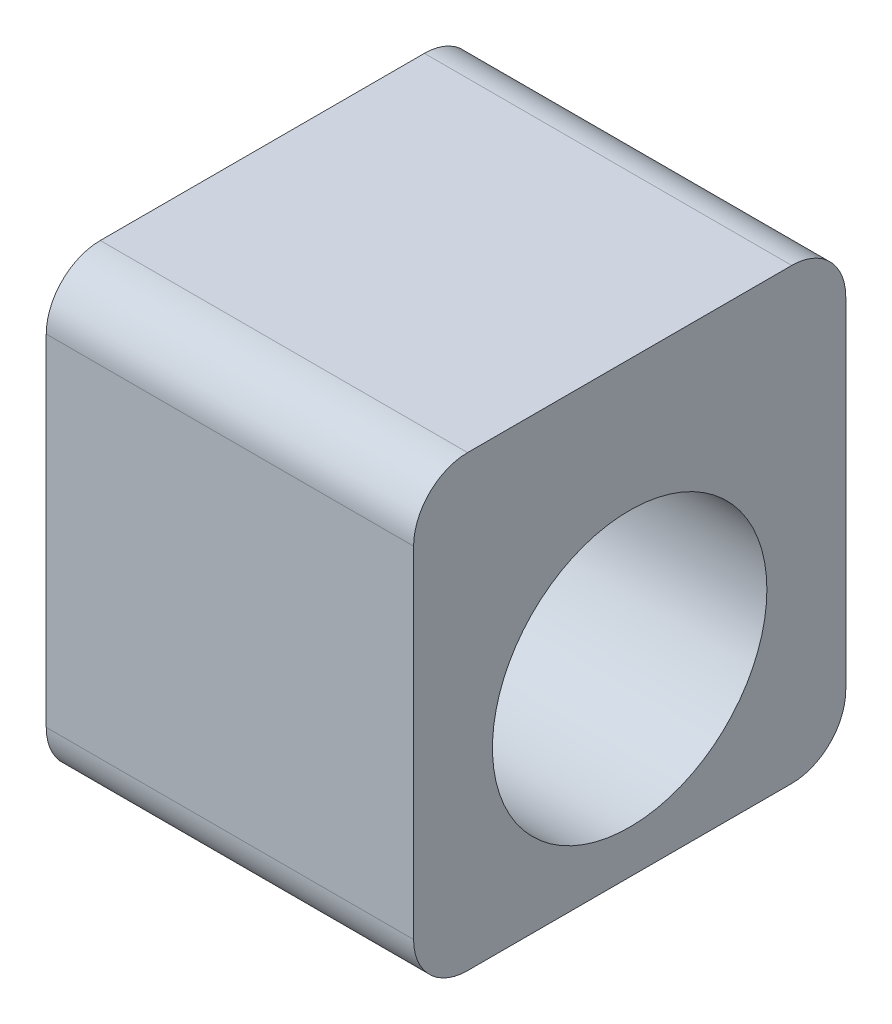
ISO-10303-21;
HEADER;
FILE_DESCRIPTION(('STEP AP214'),'2;1');
FILE_NAME('part.step','',(''),(''),'','','');
FILE_SCHEMA(('AUTOMOTIVE_DESIGN { 1 0 10303 214 1 1 1 1 }'));
ENDSEC;
DATA;
#1=APPLICATION_CONTEXT('core data for automotive mechanical design processes');
#2=APPLICATION_PROTOCOL_DEFINITION('international standard','automotive_design',2000,#1);
#3=PRODUCT_CONTEXT('',#1,'mechanical');
#4=PRODUCT('Part','Part','',(#3));
#5=PRODUCT_RELATED_PRODUCT_CATEGORY('part','',(#4));
#6=PRODUCT_DEFINITION_FORMATION('','',#4);
#7=PRODUCT_DEFINITION_CONTEXT('part definition',#1,'design');
#8=PRODUCT_DEFINITION('design','',#6,#7);
#9=PRODUCT_DEFINITION_SHAPE('','',#8);
#10=(LENGTH_UNIT() NAMED_UNIT(*) SI_UNIT(.MILLI.,.METRE.));
#11=(NAMED_UNIT(*) PLANE_ANGLE_UNIT() SI_UNIT($,.RADIAN.));
#12=(NAMED_UNIT(*) SI_UNIT($,.STERADIAN.) SOLID_ANGLE_UNIT());
#13=UNCERTAINTY_MEASURE_WITH_UNIT(LENGTH_MEASURE(1.E-05),#10,'distance_accuracy_value','');
#14=(GEOMETRIC_REPRESENTATION_CONTEXT(3) GLOBAL_UNCERTAINTY_ASSIGNED_CONTEXT((#13)) GLOBAL_UNIT_ASSIGNED_CONTEXT((#10,
#11,#12)) REPRESENTATION_CONTEXT('',''));
#15=CARTESIAN_POINT('',(0.,0.,0.));
#16=DIRECTION('',(0.,0.,1.));
#17=DIRECTION('',(1.,0.,0.));
#18=AXIS2_PLACEMENT_3D('',#15,#16,#17);
#19=CARTESIAN_POINT('',(17.,-11.7,15.));
#20=DIRECTION('',(1.,0.,0.));
#21=DIRECTION('',(0.,0.,-1.));
#22=AXIS2_PLACEMENT_3D('',#19,#20,#21);
#23=PLANE('',#22);
#24=CARTESIAN_POINT('',(17.,-11.7,15.));
#25=DIRECTION('',(1.,0.,0.));
#26=DIRECTION('',(0.,0.,-1.));
#27=AXIS2_PLACEMENT_3D('',#24,#25,#26);
#28=CIRCLE('',#27,5.);
#29=CARTESIAN_POINT('',(17.,-11.7,20.));
#30=VERTEX_POINT('',#29);
#31=CARTESIAN_POINT('',(17.,-16.7,15.));
#32=VERTEX_POINT('',#31);
#33=EDGE_CURVE('E151',#30,#32,#28,.T.);
#34=ORIENTED_EDGE('',*,*,#33,.T.);
#35=DIRECTION('',(0.,0.,-1.));
#36=VECTOR('',#35,1.);
#37=CARTESIAN_POINT('',(17.,-16.7,15.));
#38=LINE('',#37,#36);
#39=CARTESIAN_POINT('',(17.,-16.7,-15.));
#40=VERTEX_POINT('',#39);
#41=EDGE_CURVE('E99',#32,#40,#38,.T.);
#42=ORIENTED_EDGE('',*,*,#41,.T.);
#43=CARTESIAN_POINT('',(17.,-11.7,-15.));
#44=DIRECTION('',(1.,0.,0.));
#45=DIRECTION('',(0.,0.,-1.));
#46=AXIS2_PLACEMENT_3D('',#43,#44,#45);
#47=CIRCLE('',#46,5.);
#48=CARTESIAN_POINT('',(17.,-11.7,-20.));
#49=VERTEX_POINT('',#48);
#50=EDGE_CURVE('E166',#40,#49,#47,.T.);
#51=ORIENTED_EDGE('',*,*,#50,.T.);
#52=DIRECTION('',(0.,1.,0.));
#53=VECTOR('',#52,1.);
#54=CARTESIAN_POINT('',(17.,-11.7,-20.));
#55=LINE('',#54,#53);
#56=CARTESIAN_POINT('',(17.,19.826,-20.));
#57=VERTEX_POINT('',#56);
#58=EDGE_CURVE('E179',#49,#57,#55,.T.);
#59=ORIENTED_EDGE('',*,*,#58,.T.);
#60=CARTESIAN_POINT('',(17.,19.826,-15.));
#61=DIRECTION('',(1.,0.,0.));
#62=DIRECTION('',(0.,0.,-1.));
#63=AXIS2_PLACEMENT_3D('',#60,#61,#62);
#64=CIRCLE('',#63,5.);
#65=CARTESIAN_POINT('',(17.,24.826,-15.));
#66=VERTEX_POINT('',#65);
#67=EDGE_CURVE('E118',#57,#66,#64,.T.);
#68=ORIENTED_EDGE('',*,*,#67,.T.);
#69=DIRECTION('',(0.,0.,1.));
#70=VECTOR('',#69,1.);
#71=CARTESIAN_POINT('',(17.,24.826,-15.));
#72=LINE('',#71,#70);
#73=CARTESIAN_POINT('',(17.,24.826,15.));
#74=VERTEX_POINT('',#73);
#75=EDGE_CURVE('E112',#66,#74,#72,.T.);
#76=ORIENTED_EDGE('',*,*,#75,.T.);
#77=CARTESIAN_POINT('',(17.,19.826,15.));
#78=DIRECTION('',(1.,0.,0.));
#79=DIRECTION('',(0.,0.,-1.));
#80=AXIS2_PLACEMENT_3D('',#77,#78,#79);
#81=CIRCLE('',#80,5.);
#82=CARTESIAN_POINT('',(17.,19.826,20.));
#83=VERTEX_POINT('',#82);
#84=EDGE_CURVE('E116',#74,#83,#81,.T.);
#85=ORIENTED_EDGE('',*,*,#84,.T.);
#86=DIRECTION('',(0.,-1.,0.));
#87=VECTOR('',#86,1.);
#88=CARTESIAN_POINT('',(17.,19.826,20.));
#89=LINE('',#88,#87);
#90=EDGE_CURVE('E56',#83,#30,#89,.T.);
#91=ORIENTED_EDGE('',*,*,#90,.T.);
#92=EDGE_LOOP('',(#34,#42,#51,#59,#68,#76,#85,#91));
#93=FACE_BOUND('',#92,.T.);
#94=CARTESIAN_POINT('',(17.,0.,0.));
#95=DIRECTION('',(1.,0.,0.));
#96=DIRECTION('',(0.,0.,-1.));
#97=AXIS2_PLACEMENT_3D('',#94,#95,#96);
#98=CIRCLE('',#97,12.7);
#99=CARTESIAN_POINT('',(17.,0.,-12.7));
#100=VERTEX_POINT('',#99);
#101=EDGE_CURVE('E140',#100,#100,#98,.T.);
#102=ORIENTED_EDGE('',*,*,#101,.F.);
#103=EDGE_LOOP('',(#102));
#104=FACE_BOUND('',#103,.T.);
#105=ADVANCED_FACE('F39',(#93,#104),#23,.T.);
#106=CARTESIAN_POINT('',(-17.,-11.7,15.));
#107=DIRECTION('',(1.,0.,0.));
#108=DIRECTION('',(0.,0.,-1.));
#109=AXIS2_PLACEMENT_3D('',#106,#107,#108);
#110=PLANE('',#109);
#111=CARTESIAN_POINT('',(-17.,-11.7,15.));
#112=DIRECTION('',(1.,0.,0.));
#113=DIRECTION('',(0.,0.,-1.));
#114=AXIS2_PLACEMENT_3D('',#111,#112,#113);
#115=CIRCLE('',#114,5.);
#116=CARTESIAN_POINT('',(-17.,-11.7,20.));
#117=VERTEX_POINT('',#116);
#118=CARTESIAN_POINT('',(-17.,-16.7,15.));
#119=VERTEX_POINT('',#118);
#120=EDGE_CURVE('E136',#117,#119,#115,.T.);
#121=ORIENTED_EDGE('',*,*,#120,.F.);
#122=DIRECTION('',(0.,-1.,0.));
#123=VECTOR('',#122,1.);
#124=CARTESIAN_POINT('',(-17.,19.826,20.));
#125=LINE('',#124,#123);
#126=CARTESIAN_POINT('',(-17.,19.826,20.));
#127=VERTEX_POINT('',#126);
#128=EDGE_CURVE('E91',#127,#117,#125,.T.);
#129=ORIENTED_EDGE('',*,*,#128,.F.);
#130=CARTESIAN_POINT('',(-17.,19.826,15.));
#131=DIRECTION('',(1.,0.,0.));
#132=DIRECTION('',(0.,0.,-1.));
#133=AXIS2_PLACEMENT_3D('',#130,#131,#132);
#134=CIRCLE('',#133,5.);
#135=CARTESIAN_POINT('',(-17.,24.826,15.));
#136=VERTEX_POINT('',#135);
#137=EDGE_CURVE('E85',#136,#127,#134,.T.);
#138=ORIENTED_EDGE('',*,*,#137,.F.);
#139=DIRECTION('',(0.,0.,1.));
#140=VECTOR('',#139,1.);
#141=CARTESIAN_POINT('',(-17.,24.826,-15.));
#142=LINE('',#141,#140);
#143=CARTESIAN_POINT('',(-17.,24.826,-15.));
#144=VERTEX_POINT('',#143);
#145=EDGE_CURVE('E126',#144,#136,#142,.T.);
#146=ORIENTED_EDGE('',*,*,#145,.F.);
#147=CARTESIAN_POINT('',(-17.,19.826,-15.));
#148=DIRECTION('',(1.,0.,0.));
#149=DIRECTION('',(0.,0.,-1.));
#150=AXIS2_PLACEMENT_3D('',#147,#148,#149);
#151=CIRCLE('',#150,5.);
#152=CARTESIAN_POINT('',(-17.,19.826,-20.));
#153=VERTEX_POINT('',#152);
#154=EDGE_CURVE('E146',#153,#144,#151,.T.);
#155=ORIENTED_EDGE('',*,*,#154,.F.);
#156=DIRECTION('',(0.,1.,0.));
#157=VECTOR('',#156,1.);
#158=CARTESIAN_POINT('',(-17.,-11.7,-20.));
#159=LINE('',#158,#157);
#160=CARTESIAN_POINT('',(-17.,-11.7,-20.));
#161=VERTEX_POINT('',#160);
#162=EDGE_CURVE('E144',#161,#153,#159,.T.);
#163=ORIENTED_EDGE('',*,*,#162,.F.);
#164=CARTESIAN_POINT('',(-17.,-11.7,-15.));
#165=DIRECTION('',(1.,0.,0.));
#166=DIRECTION('',(0.,0.,-1.));
#167=AXIS2_PLACEMENT_3D('',#164,#165,#166);
#168=CIRCLE('',#167,5.);
#169=CARTESIAN_POINT('',(-17.,-16.7,-15.));
#170=VERTEX_POINT('',#169);
#171=EDGE_CURVE('E142',#170,#161,#168,.T.);
#172=ORIENTED_EDGE('',*,*,#171,.F.);
#173=DIRECTION('',(0.,0.,-1.));
#174=VECTOR('',#173,1.);
#175=CARTESIAN_POINT('',(-17.,-16.7,15.));
#176=LINE('',#175,#174);
#177=EDGE_CURVE('E139',#119,#170,#176,.T.);
#178=ORIENTED_EDGE('',*,*,#177,.F.);
#179=EDGE_LOOP('',(#121,#129,#138,#146,#155,#163,#172,#178));
#180=FACE_BOUND('',#179,.T.);
#181=CARTESIAN_POINT('',(-17.,0.,0.));
#182=DIRECTION('',(1.,0.,0.));
#183=DIRECTION('',(0.,0.,-1.));
#184=AXIS2_PLACEMENT_3D('',#181,#182,#183);
#185=CIRCLE('',#184,12.7);
#186=CARTESIAN_POINT('',(-17.,0.,-12.7));
#187=VERTEX_POINT('',#186);
#188=EDGE_CURVE('E185',#187,#187,#185,.T.);
#189=ORIENTED_EDGE('',*,*,#188,.T.);
#190=EDGE_LOOP('',(#189));
#191=FACE_BOUND('',#190,.T.);
#192=ADVANCED_FACE('F170',(#180,#191),#110,.F.);
#193=CARTESIAN_POINT('',(17.,-11.7,15.));
#194=DIRECTION('',(-1.,0.,0.));
#195=DIRECTION('',(0.,0.,1.));
#196=AXIS2_PLACEMENT_3D('',#193,#194,#195);
#197=CYLINDRICAL_SURFACE('',#196,5.);
#198=ORIENTED_EDGE('',*,*,#120,.T.);
#199=DIRECTION('',(-1.,0.,0.));
#200=VECTOR('',#199,1.);
#201=CARTESIAN_POINT('',(17.,-16.7,15.));
#202=LINE('',#201,#200);
#203=EDGE_CURVE('E11',#32,#119,#202,.T.);
#204=ORIENTED_EDGE('',*,*,#203,.F.);
#205=ORIENTED_EDGE('',*,*,#33,.F.);
#206=DIRECTION('',(-1.,0.,0.));
#207=VECTOR('',#206,1.);
#208=CARTESIAN_POINT('',(17.,-11.7,20.));
#209=LINE('',#208,#207);
#210=EDGE_CURVE('E132',#30,#117,#209,.T.);
#211=ORIENTED_EDGE('',*,*,#210,.T.);
#212=EDGE_LOOP('',(#198,#204,#205,#211));
#213=FACE_BOUND('',#212,.T.);
#214=ADVANCED_FACE('F41',(#213),#197,.T.);
#215=CARTESIAN_POINT('',(17.,-16.7,15.));
#216=DIRECTION('',(0.,1.,0.));
#217=DIRECTION('',(0.,0.,1.));
#218=AXIS2_PLACEMENT_3D('',#215,#216,#217);
#219=PLANE('',#218);
#220=ORIENTED_EDGE('',*,*,#177,.T.);
#221=DIRECTION('',(-1.,0.,0.));
#222=VECTOR('',#221,1.);
#223=CARTESIAN_POINT('',(17.,-16.7,-15.));
#224=LINE('',#223,#222);
#225=EDGE_CURVE('E48',#40,#170,#224,.T.);
#226=ORIENTED_EDGE('',*,*,#225,.F.);
#227=ORIENTED_EDGE('',*,*,#41,.F.);
#228=ORIENTED_EDGE('',*,*,#203,.T.);
#229=EDGE_LOOP('',(#220,#226,#227,#228));
#230=FACE_BOUND('',#229,.T.);
#231=ADVANCED_FACE('F213',(#230),#219,.F.);
#232=CARTESIAN_POINT('',(17.,-11.7,-15.));
#233=DIRECTION('',(-1.,0.,0.));
#234=DIRECTION('',(0.,0.,1.));
#235=AXIS2_PLACEMENT_3D('',#232,#233,#234);
#236=CYLINDRICAL_SURFACE('',#235,5.);
#237=ORIENTED_EDGE('',*,*,#171,.T.);
#238=DIRECTION('',(-1.,0.,0.));
#239=VECTOR('',#238,1.);
#240=CARTESIAN_POINT('',(17.,-11.7,-20.));
#241=LINE('',#240,#239);
#242=EDGE_CURVE('E158',#49,#161,#241,.T.);
#243=ORIENTED_EDGE('',*,*,#242,.F.);
#244=ORIENTED_EDGE('',*,*,#50,.F.);
#245=ORIENTED_EDGE('',*,*,#225,.T.);
#246=EDGE_LOOP('',(#237,#243,#244,#245));
#247=FACE_BOUND('',#246,.T.);
#248=ADVANCED_FACE('F164',(#247),#236,.T.);
#249=CARTESIAN_POINT('',(17.,-11.7,-20.));
#250=DIRECTION('',(0.,0.,1.));
#251=DIRECTION('',(1.,0.,0.));
#252=AXIS2_PLACEMENT_3D('',#249,#250,#251);
#253=PLANE('',#252);
#254=ORIENTED_EDGE('',*,*,#162,.T.);
#255=DIRECTION('',(-1.,0.,0.));
#256=VECTOR('',#255,1.);
#257=CARTESIAN_POINT('',(17.,19.826,-20.));
#258=LINE('',#257,#256);
#259=EDGE_CURVE('E155',#57,#153,#258,.T.);
#260=ORIENTED_EDGE('',*,*,#259,.F.);
#261=ORIENTED_EDGE('',*,*,#58,.F.);
#262=ORIENTED_EDGE('',*,*,#242,.T.);
#263=EDGE_LOOP('',(#254,#260,#261,#262));
#264=FACE_BOUND('',#263,.T.);
#265=ADVANCED_FACE('F175',(#264),#253,.F.);
#266=CARTESIAN_POINT('',(17.,19.826,-15.));
#267=DIRECTION('',(-1.,0.,0.));
#268=DIRECTION('',(0.,0.,1.));
#269=AXIS2_PLACEMENT_3D('',#266,#267,#268);
#270=CYLINDRICAL_SURFACE('',#269,5.);
#271=ORIENTED_EDGE('',*,*,#154,.T.);
#272=DIRECTION('',(-1.,0.,0.));
#273=VECTOR('',#272,1.);
#274=CARTESIAN_POINT('',(17.,24.826,-15.));
#275=LINE('',#274,#273);
#276=EDGE_CURVE('E127',#66,#144,#275,.T.);
#277=ORIENTED_EDGE('',*,*,#276,.F.);
#278=ORIENTED_EDGE('',*,*,#67,.F.);
#279=ORIENTED_EDGE('',*,*,#259,.T.);
#280=EDGE_LOOP('',(#271,#277,#278,#279));
#281=FACE_BOUND('',#280,.T.);
#282=ADVANCED_FACE('F178',(#281),#270,.T.);
#283=CARTESIAN_POINT('',(17.,24.826,-15.));
#284=DIRECTION('',(0.,-1.,0.));
#285=DIRECTION('',(0.,0.,-1.));
#286=AXIS2_PLACEMENT_3D('',#283,#284,#285);
#287=PLANE('',#286);
#288=ORIENTED_EDGE('',*,*,#145,.T.);
#289=DIRECTION('',(-1.,0.,0.));
#290=VECTOR('',#289,1.);
#291=CARTESIAN_POINT('',(17.,24.826,15.));
#292=LINE('',#291,#290);
#293=EDGE_CURVE('E123',#74,#136,#292,.T.);
#294=ORIENTED_EDGE('',*,*,#293,.F.);
#295=ORIENTED_EDGE('',*,*,#75,.F.);
#296=ORIENTED_EDGE('',*,*,#276,.T.);
#297=EDGE_LOOP('',(#288,#294,#295,#296));
#298=FACE_BOUND('',#297,.T.);
#299=ADVANCED_FACE('F124',(#298),#287,.F.);
#300=CARTESIAN_POINT('',(17.,19.826,15.));
#301=DIRECTION('',(-1.,0.,0.));
#302=DIRECTION('',(0.,0.,1.));
#303=AXIS2_PLACEMENT_3D('',#300,#301,#302);
#304=CYLINDRICAL_SURFACE('',#303,5.);
#305=ORIENTED_EDGE('',*,*,#137,.T.);
#306=DIRECTION('',(-1.,0.,0.));
#307=VECTOR('',#306,1.);
#308=CARTESIAN_POINT('',(17.,19.826,20.));
#309=LINE('',#308,#307);
#310=EDGE_CURVE('E128',#83,#127,#309,.T.);
#311=ORIENTED_EDGE('',*,*,#310,.F.);
#312=ORIENTED_EDGE('',*,*,#84,.F.);
#313=ORIENTED_EDGE('',*,*,#293,.T.);
#314=EDGE_LOOP('',(#305,#311,#312,#313));
#315=FACE_BOUND('',#314,.T.);
#316=ADVANCED_FACE('F130',(#315),#304,.T.);
#317=CARTESIAN_POINT('',(17.,19.826,20.));
#318=DIRECTION('',(0.,0.,-1.));
#319=DIRECTION('',(-1.,0.,0.));
#320=AXIS2_PLACEMENT_3D('',#317,#318,#319);
#321=PLANE('',#320);
#322=ORIENTED_EDGE('',*,*,#128,.T.);
#323=ORIENTED_EDGE('',*,*,#210,.F.);
#324=ORIENTED_EDGE('',*,*,#90,.F.);
#325=ORIENTED_EDGE('',*,*,#310,.T.);
#326=EDGE_LOOP('',(#322,#323,#324,#325));
#327=FACE_BOUND('',#326,.T.);
#328=ADVANCED_FACE('F201',(#327),#321,.F.);
#329=CARTESIAN_POINT('',(17.,0.,0.));
#330=DIRECTION('',(-1.,0.,0.));
#331=DIRECTION('',(0.,0.,1.));
#332=AXIS2_PLACEMENT_3D('',#329,#330,#331);
#333=CYLINDRICAL_SURFACE('',#332,12.7);
#334=ORIENTED_EDGE('',*,*,#101,.T.);
#335=EDGE_LOOP('',(#334));
#336=FACE_BOUND('',#335,.T.);
#337=ORIENTED_EDGE('',*,*,#188,.F.);
#338=EDGE_LOOP('',(#337));
#339=FACE_BOUND('',#338,.T.);
#340=ADVANCED_FACE('F191',(#336,#339),#333,.F.);
#341=CLOSED_SHELL('',(#105,#192,#214,#231,#248,#265,#282,#299,#316,#328,#340));
#342=MANIFOLD_SOLID_BREP('B2',#341);
#343=ADVANCED_BREP_SHAPE_REPRESENTATION('',(#18,#342),#14);
#344=SHAPE_DEFINITION_REPRESENTATION(#9,#343);
ENDSEC;
END-ISO-10303-21;
